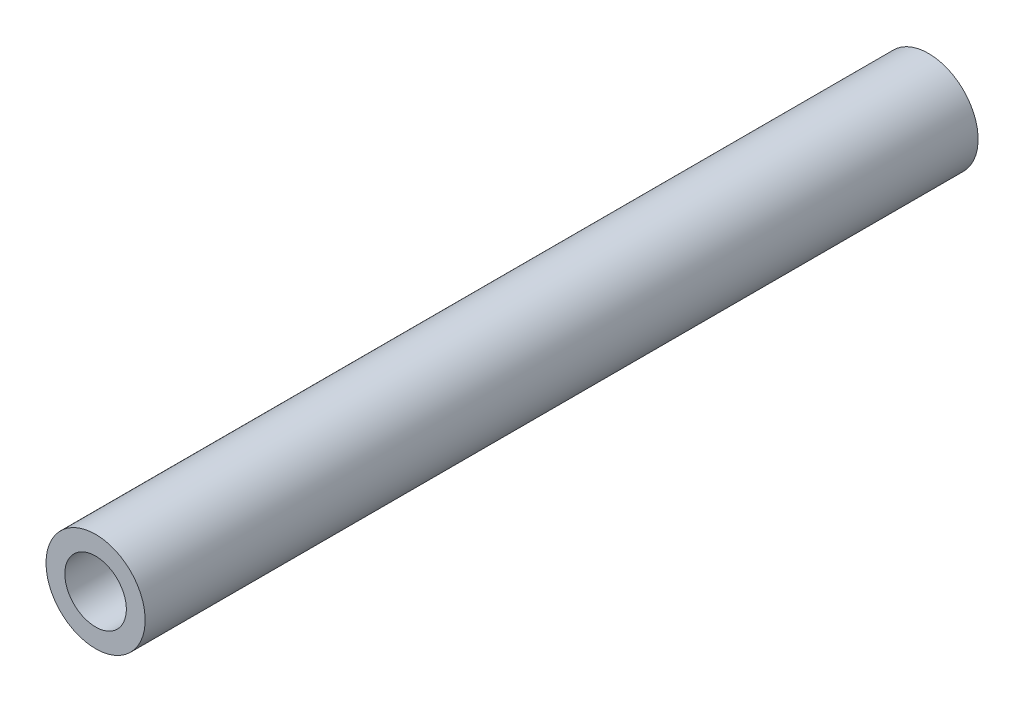
ISO-10303-21;
HEADER;
FILE_DESCRIPTION(('STEP AP214'),'2;1');
FILE_NAME('part.step','',(''),(''),'','','');
FILE_SCHEMA(('AUTOMOTIVE_DESIGN { 1 0 10303 214 1 1 1 1 }'));
ENDSEC;
DATA;
#1=APPLICATION_CONTEXT('core data for automotive mechanical design processes');
#2=APPLICATION_PROTOCOL_DEFINITION('international standard','automotive_design',2000,#1);
#3=PRODUCT_CONTEXT('',#1,'mechanical');
#4=PRODUCT('Part','Part','',(#3));
#5=PRODUCT_RELATED_PRODUCT_CATEGORY('part','',(#4));
#6=PRODUCT_DEFINITION_FORMATION('','',#4);
#7=PRODUCT_DEFINITION_CONTEXT('part definition',#1,'design');
#8=PRODUCT_DEFINITION('design','',#6,#7);
#9=PRODUCT_DEFINITION_SHAPE('','',#8);
#10=(LENGTH_UNIT() NAMED_UNIT(*) SI_UNIT(.MILLI.,.METRE.));
#11=(NAMED_UNIT(*) PLANE_ANGLE_UNIT() SI_UNIT($,.RADIAN.));
#12=(NAMED_UNIT(*) SI_UNIT($,.STERADIAN.) SOLID_ANGLE_UNIT());
#13=UNCERTAINTY_MEASURE_WITH_UNIT(LENGTH_MEASURE(1.E-05),#10,'distance_accuracy_value','');
#14=(GEOMETRIC_REPRESENTATION_CONTEXT(3) GLOBAL_UNCERTAINTY_ASSIGNED_CONTEXT((#13)) GLOBAL_UNIT_ASSIGNED_CONTEXT((#10,
#11,#12)) REPRESENTATION_CONTEXT('',''));
#15=CARTESIAN_POINT('',(0.,0.,0.));
#16=DIRECTION('',(0.,0.,1.));
#17=DIRECTION('',(1.,0.,0.));
#18=AXIS2_PLACEMENT_3D('',#15,#16,#17);
#19=CARTESIAN_POINT('',(0.,0.,42.));
#20=DIRECTION('',(0.,0.,1.));
#21=DIRECTION('',(1.,0.,0.));
#22=AXIS2_PLACEMENT_3D('',#19,#20,#21);
#23=PLANE('',#22);
#24=CARTESIAN_POINT('',(0.,0.,42.));
#25=DIRECTION('',(0.,0.,1.));
#26=DIRECTION('',(1.,0.,0.));
#27=AXIS2_PLACEMENT_3D('',#24,#25,#26);
#28=CIRCLE('',#27,2.5);
#29=CARTESIAN_POINT('',(-2.5,0.,42.));
#30=VERTEX_POINT('',#29);
#31=EDGE_CURVE('E10',#30,#30,#28,.T.);
#32=ORIENTED_EDGE('',*,*,#31,.T.);
#33=EDGE_LOOP('',(#32));
#34=FACE_BOUND('',#33,.T.);
#35=CARTESIAN_POINT('',(0.,0.,42.));
#36=DIRECTION('',(0.,0.,1.));
#37=DIRECTION('',(1.,0.,0.));
#38=AXIS2_PLACEMENT_3D('',#35,#36,#37);
#39=CIRCLE('',#38,1.55);
#40=CARTESIAN_POINT('',(-1.55,0.,42.));
#41=VERTEX_POINT('',#40);
#42=EDGE_CURVE('E52',#41,#41,#39,.T.);
#43=ORIENTED_EDGE('',*,*,#42,.F.);
#44=EDGE_LOOP('',(#43));
#45=FACE_BOUND('',#44,.T.);
#46=ADVANCED_FACE('F39',(#34,#45),#23,.T.);
#47=CARTESIAN_POINT('',(0.,0.,0.));
#48=DIRECTION('',(0.,0.,1.));
#49=DIRECTION('',(1.,0.,0.));
#50=AXIS2_PLACEMENT_3D('',#47,#48,#49);
#51=PLANE('',#50);
#52=CARTESIAN_POINT('',(0.,0.,0.));
#53=DIRECTION('',(0.,0.,1.));
#54=DIRECTION('',(1.,0.,0.));
#55=AXIS2_PLACEMENT_3D('',#52,#53,#54);
#56=CIRCLE('',#55,2.5);
#57=CARTESIAN_POINT('',(-2.5,0.,0.));
#58=VERTEX_POINT('',#57);
#59=EDGE_CURVE('E43',#58,#58,#56,.T.);
#60=ORIENTED_EDGE('',*,*,#59,.F.);
#61=EDGE_LOOP('',(#60));
#62=FACE_BOUND('',#61,.T.);
#63=CARTESIAN_POINT('',(0.,0.,0.));
#64=DIRECTION('',(0.,0.,1.));
#65=DIRECTION('',(1.,0.,0.));
#66=AXIS2_PLACEMENT_3D('',#63,#64,#65);
#67=CIRCLE('',#66,1.55);
#68=CARTESIAN_POINT('',(-1.55,0.,0.));
#69=VERTEX_POINT('',#68);
#70=EDGE_CURVE('E54',#69,#69,#67,.T.);
#71=ORIENTED_EDGE('',*,*,#70,.T.);
#72=EDGE_LOOP('',(#71));
#73=FACE_BOUND('',#72,.T.);
#74=ADVANCED_FACE('F66',(#62,#73),#51,.F.);
#75=CARTESIAN_POINT('',(0.,0.,42.));
#76=DIRECTION('',(0.,0.,-1.));
#77=DIRECTION('',(-1.,0.,0.));
#78=AXIS2_PLACEMENT_3D('',#75,#76,#77);
#79=CYLINDRICAL_SURFACE('',#78,2.5);
#80=CARTESIAN_POINT('',(-2.5,0.,42.));
#81=CARTESIAN_POINT('',(-2.5,0.,41.5625));
#82=CARTESIAN_POINT('',(-2.5,0.,41.125));
#83=CARTESIAN_POINT('',(-2.5,0.,40.25));
#84=CARTESIAN_POINT('',(-2.5,0.,39.8125));
#85=CARTESIAN_POINT('',(-2.5,0.,38.9375));
#86=CARTESIAN_POINT('',(-2.5,0.,38.5));
#87=CARTESIAN_POINT('',(-2.5,0.,37.625));
#88=CARTESIAN_POINT('',(-2.5,0.,37.1875));
#89=CARTESIAN_POINT('',(-2.5,0.,36.3125));
#90=CARTESIAN_POINT('',(-2.5,0.,35.875));
#91=CARTESIAN_POINT('',(-2.5,0.,35.));
#92=CARTESIAN_POINT('',(-2.5,0.,34.5625));
#93=CARTESIAN_POINT('',(-2.5,0.,33.6875));
#94=CARTESIAN_POINT('',(-2.5,0.,33.25));
#95=CARTESIAN_POINT('',(-2.5,0.,32.375));
#96=CARTESIAN_POINT('',(-2.5,0.,31.9375));
#97=CARTESIAN_POINT('',(-2.5,0.,31.0625));
#98=CARTESIAN_POINT('',(-2.5,0.,30.625));
#99=CARTESIAN_POINT('',(-2.5,0.,29.75));
#100=CARTESIAN_POINT('',(-2.5,0.,29.3125));
#101=CARTESIAN_POINT('',(-2.5,0.,28.4375));
#102=CARTESIAN_POINT('',(-2.5,0.,28.));
#103=CARTESIAN_POINT('',(-2.5,0.,27.125));
#104=CARTESIAN_POINT('',(-2.5,0.,26.6875));
#105=CARTESIAN_POINT('',(-2.5,0.,25.8125));
#106=CARTESIAN_POINT('',(-2.5,0.,25.375));
#107=CARTESIAN_POINT('',(-2.5,0.,24.5));
#108=CARTESIAN_POINT('',(-2.5,0.,24.0625));
#109=CARTESIAN_POINT('',(-2.5,0.,23.1875));
#110=CARTESIAN_POINT('',(-2.5,0.,22.75));
#111=CARTESIAN_POINT('',(-2.5,0.,21.875));
#112=CARTESIAN_POINT('',(-2.5,0.,21.4375));
#113=CARTESIAN_POINT('',(-2.5,0.,20.5625));
#114=CARTESIAN_POINT('',(-2.5,0.,20.125));
#115=CARTESIAN_POINT('',(-2.5,0.,19.25));
#116=CARTESIAN_POINT('',(-2.5,0.,18.8125));
#117=CARTESIAN_POINT('',(-2.5,0.,17.9375));
#118=CARTESIAN_POINT('',(-2.5,0.,17.5));
#119=CARTESIAN_POINT('',(-2.5,0.,16.625));
#120=CARTESIAN_POINT('',(-2.5,0.,16.1875));
#121=CARTESIAN_POINT('',(-2.5,0.,15.3125));
#122=CARTESIAN_POINT('',(-2.5,0.,14.875));
#123=CARTESIAN_POINT('',(-2.5,0.,14.));
#124=CARTESIAN_POINT('',(-2.5,0.,13.5625));
#125=CARTESIAN_POINT('',(-2.5,0.,12.6875));
#126=CARTESIAN_POINT('',(-2.5,0.,12.25));
#127=CARTESIAN_POINT('',(-2.5,0.,11.375));
#128=CARTESIAN_POINT('',(-2.5,0.,10.9375));
#129=CARTESIAN_POINT('',(-2.5,0.,10.0625));
#130=CARTESIAN_POINT('',(-2.5,0.,9.625));
#131=CARTESIAN_POINT('',(-2.5,0.,8.75));
#132=CARTESIAN_POINT('',(-2.5,0.,8.3125));
#133=CARTESIAN_POINT('',(-2.5,0.,7.4375));
#134=CARTESIAN_POINT('',(-2.5,0.,7.));
#135=CARTESIAN_POINT('',(-2.5,0.,6.125));
#136=CARTESIAN_POINT('',(-2.5,0.,5.6875));
#137=CARTESIAN_POINT('',(-2.5,0.,4.8125));
#138=CARTESIAN_POINT('',(-2.5,0.,4.375));
#139=CARTESIAN_POINT('',(-2.5,0.,3.5));
#140=CARTESIAN_POINT('',(-2.5,0.,3.0625));
#141=CARTESIAN_POINT('',(-2.5,0.,2.1875));
#142=CARTESIAN_POINT('',(-2.5,0.,1.75));
#143=CARTESIAN_POINT('',(-2.5,0.,0.875000000000001));
#144=CARTESIAN_POINT('',(-2.5,0.,0.4375));
#145=CARTESIAN_POINT('',(-2.5,0.,0.));
#146=B_SPLINE_CURVE_WITH_KNOTS('',3,(#80,#81,#82,#83,#84,#85,#86,#87,#88,#89,#90,#91,#92,#93,
#94,#95,#96,#97,#98,#99,#100,#101,#102,#103,#104,#105,#106,#107,#108,#109,#110,#111,#112,#113,
#114,#115,#116,#117,#118,#119,#120,#121,#122,#123,#124,#125,#126,#127,#128,#129,#130,#131,#132,
#133,#134,#135,#136,#137,#138,#139,#140,#141,#142,#143,#144,#145),.UNSPECIFIED.,.F.,.F.,(4,2,2,
2,2,2,2,2,2,2,2,2,2,2,2,2,2,2,2,2,2,2,2,2,2,2,2,2,2,2,2,2,4),(0.,1.3125,2.625,3.9375,5.25,
6.56250000000001,7.875,9.1875,10.5,11.8125,13.125,14.4375,15.75,17.0625,18.375,19.6875,21.,
22.3125,23.625,24.9375,26.25,27.5625,28.875,30.1875,31.5,32.8125,34.125,35.4375,36.75,38.0625,
39.375,40.6875,42.),.UNSPECIFIED.);
#147=EDGE_CURVE('BSEAM41',#30,#58,#146,.T.);
#148=ORIENTED_EDGE('',*,*,#31,.F.);
#149=ORIENTED_EDGE('',*,*,#59,.T.);
#150=ORIENTED_EDGE('',*,*,#147,.T.);
#151=ORIENTED_EDGE('',*,*,#147,.F.);
#152=EDGE_LOOP('',(#148,#150,#149,#151));
#153=FACE_BOUND('',#152,.T.);
#154=ADVANCED_FACE('F41',(#153),#79,.T.);
#155=CARTESIAN_POINT('',(0.,0.,42.));
#156=DIRECTION('',(0.,0.,-1.));
#157=DIRECTION('',(-1.,0.,0.));
#158=AXIS2_PLACEMENT_3D('',#155,#156,#157);
#159=CYLINDRICAL_SURFACE('',#158,1.55);
#160=CARTESIAN_POINT('',(-1.55,0.,42.));
#161=CARTESIAN_POINT('',(-1.55,0.,41.5625));
#162=CARTESIAN_POINT('',(-1.55,0.,41.125));
#163=CARTESIAN_POINT('',(-1.55,0.,40.25));
#164=CARTESIAN_POINT('',(-1.55,0.,39.8125));
#165=CARTESIAN_POINT('',(-1.55,0.,38.9375));
#166=CARTESIAN_POINT('',(-1.55,0.,38.5));
#167=CARTESIAN_POINT('',(-1.55,0.,37.625));
#168=CARTESIAN_POINT('',(-1.55,0.,37.1875));
#169=CARTESIAN_POINT('',(-1.55,0.,36.3125));
#170=CARTESIAN_POINT('',(-1.55,0.,35.875));
#171=CARTESIAN_POINT('',(-1.55,0.,35.));
#172=CARTESIAN_POINT('',(-1.55,0.,34.5625));
#173=CARTESIAN_POINT('',(-1.55,0.,33.6875));
#174=CARTESIAN_POINT('',(-1.55,0.,33.25));
#175=CARTESIAN_POINT('',(-1.55,0.,32.375));
#176=CARTESIAN_POINT('',(-1.55,0.,31.9375));
#177=CARTESIAN_POINT('',(-1.55,0.,31.0625));
#178=CARTESIAN_POINT('',(-1.55,0.,30.625));
#179=CARTESIAN_POINT('',(-1.55,0.,29.75));
#180=CARTESIAN_POINT('',(-1.55,0.,29.3125));
#181=CARTESIAN_POINT('',(-1.55,0.,28.4375));
#182=CARTESIAN_POINT('',(-1.55,0.,28.));
#183=CARTESIAN_POINT('',(-1.55,0.,27.125));
#184=CARTESIAN_POINT('',(-1.55,0.,26.6875));
#185=CARTESIAN_POINT('',(-1.55,0.,25.8125));
#186=CARTESIAN_POINT('',(-1.55,0.,25.375));
#187=CARTESIAN_POINT('',(-1.55,0.,24.5));
#188=CARTESIAN_POINT('',(-1.55,0.,24.0625));
#189=CARTESIAN_POINT('',(-1.55,0.,23.1875));
#190=CARTESIAN_POINT('',(-1.55,0.,22.75));
#191=CARTESIAN_POINT('',(-1.55,0.,21.875));
#192=CARTESIAN_POINT('',(-1.55,0.,21.4375));
#193=CARTESIAN_POINT('',(-1.55,0.,20.5625));
#194=CARTESIAN_POINT('',(-1.55,0.,20.125));
#195=CARTESIAN_POINT('',(-1.55,0.,19.25));
#196=CARTESIAN_POINT('',(-1.55,0.,18.8125));
#197=CARTESIAN_POINT('',(-1.55,0.,17.9375));
#198=CARTESIAN_POINT('',(-1.55,0.,17.5));
#199=CARTESIAN_POINT('',(-1.55,0.,16.625));
#200=CARTESIAN_POINT('',(-1.55,0.,16.1875));
#201=CARTESIAN_POINT('',(-1.55,0.,15.3125));
#202=CARTESIAN_POINT('',(-1.55,0.,14.875));
#203=CARTESIAN_POINT('',(-1.55,0.,14.));
#204=CARTESIAN_POINT('',(-1.55,0.,13.5625));
#205=CARTESIAN_POINT('',(-1.55,0.,12.6875));
#206=CARTESIAN_POINT('',(-1.55,0.,12.25));
#207=CARTESIAN_POINT('',(-1.55,0.,11.375));
#208=CARTESIAN_POINT('',(-1.55,0.,10.9375));
#209=CARTESIAN_POINT('',(-1.55,0.,10.0625));
#210=CARTESIAN_POINT('',(-1.55,0.,9.625));
#211=CARTESIAN_POINT('',(-1.55,0.,8.75));
#212=CARTESIAN_POINT('',(-1.55,0.,8.3125));
#213=CARTESIAN_POINT('',(-1.55,0.,7.4375));
#214=CARTESIAN_POINT('',(-1.55,0.,7.));
#215=CARTESIAN_POINT('',(-1.55,0.,6.125));
#216=CARTESIAN_POINT('',(-1.55,0.,5.6875));
#217=CARTESIAN_POINT('',(-1.55,0.,4.8125));
#218=CARTESIAN_POINT('',(-1.55,0.,4.375));
#219=CARTESIAN_POINT('',(-1.55,0.,3.5));
#220=CARTESIAN_POINT('',(-1.55,0.,3.0625));
#221=CARTESIAN_POINT('',(-1.55,0.,2.1875));
#222=CARTESIAN_POINT('',(-1.55,0.,1.75));
#223=CARTESIAN_POINT('',(-1.55,0.,0.875000000000001));
#224=CARTESIAN_POINT('',(-1.55,0.,0.4375));
#225=CARTESIAN_POINT('',(-1.55,0.,0.));
#226=B_SPLINE_CURVE_WITH_KNOTS('',3,(#160,#161,#162,#163,#164,#165,#166,#167,#168,#169,#170,
#171,#172,#173,#174,#175,#176,#177,#178,#179,#180,#181,#182,#183,#184,#185,#186,#187,#188,#189,
#190,#191,#192,#193,#194,#195,#196,#197,#198,#199,#200,#201,#202,#203,#204,#205,#206,#207,#208,
#209,#210,#211,#212,#213,#214,#215,#216,#217,#218,#219,#220,#221,#222,#223,#224,#225),
.UNSPECIFIED.,.F.,.F.,(4,2,2,2,2,2,2,2,2,2,2,2,2,2,2,2,2,2,2,2,2,2,2,2,2,2,2,2,2,2,2,2,4),(0.,
1.31249999999999,2.625,3.9375,5.25,6.5625,7.87499999999999,9.18749999999999,10.5,11.8125,13.125,
14.4375,15.75,17.0625,18.375,19.6875,21.,22.3125,23.625,24.9375,26.25,27.5625,28.875,30.1875,
31.5,32.8125,34.125,35.4375,36.75,38.0625,39.375,40.6875,42.),.UNSPECIFIED.);
#227=EDGE_CURVE('BSEAM62',#41,#69,#226,.T.);
#228=ORIENTED_EDGE('',*,*,#42,.T.);
#229=ORIENTED_EDGE('',*,*,#70,.F.);
#230=ORIENTED_EDGE('',*,*,#227,.T.);
#231=ORIENTED_EDGE('',*,*,#227,.F.);
#232=EDGE_LOOP('',(#228,#230,#229,#231));
#233=FACE_BOUND('',#232,.T.);
#234=ADVANCED_FACE('F62',(#233),#159,.F.);
#235=CLOSED_SHELL('',(#46,#74,#154,#234));
#236=MANIFOLD_SOLID_BREP('B2',#235);
#237=ADVANCED_BREP_SHAPE_REPRESENTATION('',(#18,#236),#14);
#238=SHAPE_DEFINITION_REPRESENTATION(#9,#237);
ENDSEC;
END-ISO-10303-21;
